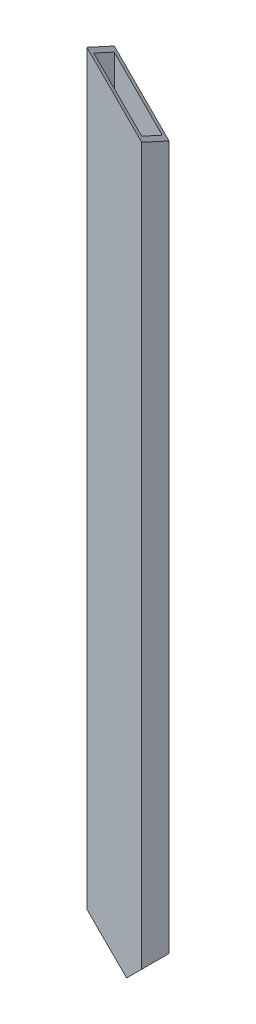
ISO-10303-21;
HEADER;
FILE_DESCRIPTION(('STEP AP214'),'2;1');
FILE_NAME('part.step','',(''),(''),'','','');
FILE_SCHEMA(('AUTOMOTIVE_DESIGN { 1 0 10303 214 1 1 1 1 }'));
ENDSEC;
DATA;
#1=APPLICATION_CONTEXT('core data for automotive mechanical design processes');
#2=APPLICATION_PROTOCOL_DEFINITION('international standard','automotive_design',2000,#1);
#3=PRODUCT_CONTEXT('',#1,'mechanical');
#4=PRODUCT('Part','Part','',(#3));
#5=PRODUCT_RELATED_PRODUCT_CATEGORY('part','',(#4));
#6=PRODUCT_DEFINITION_FORMATION('','',#4);
#7=PRODUCT_DEFINITION_CONTEXT('part definition',#1,'design');
#8=PRODUCT_DEFINITION('design','',#6,#7);
#9=PRODUCT_DEFINITION_SHAPE('','',#8);
#10=(LENGTH_UNIT() NAMED_UNIT(*) SI_UNIT(.MILLI.,.METRE.));
#11=(NAMED_UNIT(*) PLANE_ANGLE_UNIT() SI_UNIT($,.RADIAN.));
#12=(NAMED_UNIT(*) SI_UNIT($,.STERADIAN.) SOLID_ANGLE_UNIT());
#13=UNCERTAINTY_MEASURE_WITH_UNIT(LENGTH_MEASURE(1.E-05),#10,'distance_accuracy_value','');
#14=(GEOMETRIC_REPRESENTATION_CONTEXT(3) GLOBAL_UNCERTAINTY_ASSIGNED_CONTEXT((#13)) GLOBAL_UNIT_ASSIGNED_CONTEXT((#10,
#11,#12)) REPRESENTATION_CONTEXT('',''));
#15=CARTESIAN_POINT('',(0.,0.,0.));
#16=DIRECTION('',(0.,0.,1.));
#17=DIRECTION('',(1.,0.,0.));
#18=AXIS2_PLACEMENT_3D('',#15,#16,#17);
#19=CARTESIAN_POINT('',(25.4,728.3704,12.7));
#20=DIRECTION('',(-1.,0.,0.));
#21=DIRECTION('',(0.,0.,1.));
#22=AXIS2_PLACEMENT_3D('',#19,#20,#21);
#23=PLANE('',#22);
#24=DIRECTION('',(0.,-1.,0.));
#25=VECTOR('',#24,1.);
#26=CARTESIAN_POINT('',(25.4,728.3704,-12.7));
#27=LINE('',#26,#25);
#28=CARTESIAN_POINT('',(25.4,665.898951636196,-12.7));
#29=VERTEX_POINT('',#28);
#30=CARTESIAN_POINT('',(25.4,13.9954000000001,-12.7));
#31=VERTEX_POINT('',#30);
#32=EDGE_CURVE('E57',#29,#31,#27,.T.);
#33=ORIENTED_EDGE('',*,*,#32,.F.);
#34=DIRECTION('',(0.,0.4175349702472,0.908660854566031));
#35=VECTOR('',#34,1.);
#36=CARTESIAN_POINT('',(25.4,686.426640930071,31.9734022901014));
#37=LINE('',#36,#35);
#38=CARTESIAN_POINT('',(25.4,677.570400000001,12.7));
#39=VERTEX_POINT('',#38);
#40=EDGE_CURVE('E126',#29,#39,#37,.T.);
#41=ORIENTED_EDGE('',*,*,#40,.T.);
#42=DIRECTION('',(0.,-1.,0.));
#43=VECTOR('',#42,1.);
#44=CARTESIAN_POINT('',(25.4,728.3704,12.7));
#45=LINE('',#44,#43);
#46=CARTESIAN_POINT('',(25.4,13.9954000000001,12.7));
#47=VERTEX_POINT('',#46);
#48=EDGE_CURVE('E156',#39,#47,#45,.T.);
#49=ORIENTED_EDGE('',*,*,#48,.T.);
#50=DIRECTION('',(0.,0.,1.));
#51=VECTOR('',#50,1.);
#52=CARTESIAN_POINT('',(25.4,13.9954000000001,-12.7));
#53=LINE('',#52,#51);
#54=EDGE_CURVE('E150',#31,#47,#53,.T.);
#55=ORIENTED_EDGE('',*,*,#54,.F.);
#56=EDGE_LOOP('',(#33,#41,#49,#55));
#57=FACE_BOUND('',#56,.T.);
#58=ADVANCED_FACE('F50',(#57),#23,.F.);
#59=CARTESIAN_POINT('',(-25.4,728.3704,-12.7));
#60=DIRECTION('',(0.,0.,1.));
#61=DIRECTION('',(1.,0.,0.));
#62=AXIS2_PLACEMENT_3D('',#59,#60,#61);
#63=PLANE('',#62);
#64=DIRECTION('',(0.,-1.,0.));
#65=VECTOR('',#64,1.);
#66=CARTESIAN_POINT('',(-25.4,728.3704,-12.7));
#67=LINE('',#66,#65);
#68=CARTESIAN_POINT('',(-25.4,716.698951636195,-12.7));
#69=VERTEX_POINT('',#68);
#70=CARTESIAN_POINT('',(-25.4,36.8046,-12.7));
#71=VERTEX_POINT('',#70);
#72=EDGE_CURVE('E146',#69,#71,#67,.T.);
#73=ORIENTED_EDGE('',*,*,#72,.F.);
#74=DIRECTION('',(-0.707106781186556,0.707106781186539,0.));
#75=VECTOR('',#74,1.);
#76=CARTESIAN_POINT('',(483.979529996083,207.319421640124,-12.7));
#77=LINE('',#76,#75);
#78=EDGE_CURVE('E129',#29,#69,#77,.T.);
#79=ORIENTED_EDGE('',*,*,#78,.F.);
#80=ORIENTED_EDGE('',*,*,#32,.T.);
#81=DIRECTION('',(0.707106781186546,0.707106781186549,0.));
#82=VECTOR('',#81,1.);
#83=CARTESIAN_POINT('',(5.70230000000003,-5.7023,-12.7));
#84=LINE('',#83,#82);
#85=CARTESIAN_POINT('',(11.4046,0.,-12.7));
#86=VERTEX_POINT('',#85);
#87=EDGE_CURVE('E191',#86,#31,#84,.T.);
#88=ORIENTED_EDGE('',*,*,#87,.F.);
#89=DIRECTION('',(-0.707106781186548,0.707106781186548,0.));
#90=VECTOR('',#89,1.);
#91=CARTESIAN_POINT('',(5.7023,5.7023,-12.7));
#92=LINE('',#91,#90);
#93=EDGE_CURVE('E181',#86,#71,#92,.T.);
#94=ORIENTED_EDGE('',*,*,#93,.T.);
#95=EDGE_LOOP('',(#73,#79,#80,#88,#94));
#96=FACE_BOUND('',#95,.T.);
#97=ADVANCED_FACE('F142',(#96),#63,.F.);
#98=CARTESIAN_POINT('',(-25.4,728.3704,12.7));
#99=DIRECTION('',(0.,0.,-1.));
#100=DIRECTION('',(-1.,0.,0.));
#101=AXIS2_PLACEMENT_3D('',#98,#99,#100);
#102=PLANE('',#101);
#103=DIRECTION('',(0.707106781186546,0.707106781186549,0.));
#104=VECTOR('',#103,1.);
#105=CARTESIAN_POINT('',(5.70230000000003,-5.7023,12.7));
#106=LINE('',#105,#104);
#107=CARTESIAN_POINT('',(11.4046,0.,12.7));
#108=VERTEX_POINT('',#107);
#109=EDGE_CURVE('E137',#108,#47,#106,.T.);
#110=ORIENTED_EDGE('',*,*,#109,.T.);
#111=ORIENTED_EDGE('',*,*,#48,.F.);
#112=DIRECTION('',(0.707106781186556,-0.707106781186539,0.));
#113=VECTOR('',#112,1.);
#114=CARTESIAN_POINT('',(351.4852,351.485200000009,12.7));
#115=LINE('',#114,#113);
#116=CARTESIAN_POINT('',(-25.4,728.3704,12.7));
#117=VERTEX_POINT('',#116);
#118=EDGE_CURVE('E132',#117,#39,#115,.T.);
#119=ORIENTED_EDGE('',*,*,#118,.F.);
#120=DIRECTION('',(0.,-1.,0.));
#121=VECTOR('',#120,1.);
#122=CARTESIAN_POINT('',(-25.4,728.3704,12.7));
#123=LINE('',#122,#121);
#124=CARTESIAN_POINT('',(-25.4,36.8046,12.7));
#125=VERTEX_POINT('',#124);
#126=EDGE_CURVE('E151',#117,#125,#123,.T.);
#127=ORIENTED_EDGE('',*,*,#126,.T.);
#128=DIRECTION('',(-0.707106781186548,0.707106781186548,0.));
#129=VECTOR('',#128,1.);
#130=CARTESIAN_POINT('',(5.7023,5.7023,12.7));
#131=LINE('',#130,#129);
#132=EDGE_CURVE('E179',#108,#125,#131,.T.);
#133=ORIENTED_EDGE('',*,*,#132,.F.);
#134=EDGE_LOOP('',(#110,#111,#119,#127,#133));
#135=FACE_BOUND('',#134,.T.);
#136=ADVANCED_FACE('F231',(#135),#102,.F.);
#137=CARTESIAN_POINT('',(-22.225,728.3704,9.525));
#138=DIRECTION('',(0.,0.,-1.));
#139=DIRECTION('',(-1.,0.,0.));
#140=AXIS2_PLACEMENT_3D('',#137,#138,#139);
#141=PLANE('',#140);
#142=DIRECTION('',(-0.707106781186556,0.707106781186539,0.));
#143=VECTOR('',#142,1.);
#144=CARTESIAN_POINT('',(-24.5419655227377,726.053434477262,9.525));
#145=LINE('',#144,#143);
#146=CARTESIAN_POINT('',(22.225,679.286468954526,9.525));
#147=VERTEX_POINT('',#146);
#148=CARTESIAN_POINT('',(-22.225,723.736468954525,9.52500000000001));
#149=VERTEX_POINT('',#148);
#150=EDGE_CURVE('E64',#147,#149,#145,.T.);
#151=ORIENTED_EDGE('',*,*,#150,.F.);
#152=DIRECTION('',(0.,-1.,0.));
#153=VECTOR('',#152,1.);
#154=CARTESIAN_POINT('',(22.225,728.3704,9.525));
#155=LINE('',#154,#153);
#156=CARTESIAN_POINT('',(22.225,10.8204,9.525));
#157=VERTEX_POINT('',#156);
#158=EDGE_CURVE('E160',#147,#157,#155,.T.);
#159=ORIENTED_EDGE('',*,*,#158,.T.);
#160=DIRECTION('',(-0.707106781186546,-0.707106781186549,0.));
#161=VECTOR('',#160,1.);
#162=CARTESIAN_POINT('',(358.775,347.370400000002,9.525));
#163=LINE('',#162,#161);
#164=CARTESIAN_POINT('',(11.4046,0.,9.525));
#165=VERTEX_POINT('',#164);
#166=EDGE_CURVE('E182',#157,#165,#163,.T.);
#167=ORIENTED_EDGE('',*,*,#166,.T.);
#168=DIRECTION('',(0.707106781186548,-0.707106781186548,0.));
#169=VECTOR('',#168,1.);
#170=CARTESIAN_POINT('',(-369.5954,381.,9.525));
#171=LINE('',#170,#169);
#172=CARTESIAN_POINT('',(-22.225,33.6296,9.525));
#173=VERTEX_POINT('',#172);
#174=EDGE_CURVE('E167',#173,#165,#171,.T.);
#175=ORIENTED_EDGE('',*,*,#174,.F.);
#176=DIRECTION('',(0.,-1.,0.));
#177=VECTOR('',#176,1.);
#178=CARTESIAN_POINT('',(-22.225,728.3704,9.525));
#179=LINE('',#178,#177);
#180=EDGE_CURVE('E158',#149,#173,#179,.T.);
#181=ORIENTED_EDGE('',*,*,#180,.F.);
#182=EDGE_LOOP('',(#151,#159,#167,#175,#181));
#183=FACE_BOUND('',#182,.T.);
#184=ADVANCED_FACE('F217',(#183),#141,.T.);
#185=CARTESIAN_POINT('',(22.225,728.3704,9.525));
#186=DIRECTION('',(-1.,0.,0.));
#187=DIRECTION('',(0.,0.,1.));
#188=AXIS2_PLACEMENT_3D('',#185,#186,#187);
#189=PLANE('',#188);
#190=DIRECTION('',(0.,0.4175349702472,0.908660854566031));
#191=VECTOR('',#190,1.);
#192=CARTESIAN_POINT('',(22.225,687.84353822881,28.1473297050994));
#193=LINE('',#192,#191);
#194=CARTESIAN_POINT('',(22.225,670.532882681672,-9.525));
#195=VERTEX_POINT('',#194);
#196=EDGE_CURVE('E197',#195,#147,#193,.T.);
#197=ORIENTED_EDGE('',*,*,#196,.F.);
#198=DIRECTION('',(0.,-1.,0.));
#199=VECTOR('',#198,1.);
#200=CARTESIAN_POINT('',(22.225,728.3704,-9.525));
#201=LINE('',#200,#199);
#202=CARTESIAN_POINT('',(22.225,10.8204,-9.525));
#203=VERTEX_POINT('',#202);
#204=EDGE_CURVE('E162',#195,#203,#201,.T.);
#205=ORIENTED_EDGE('',*,*,#204,.T.);
#206=DIRECTION('',(0.,0.,1.));
#207=VECTOR('',#206,1.);
#208=CARTESIAN_POINT('',(22.225,10.8204,9.52500000000013));
#209=LINE('',#208,#207);
#210=EDGE_CURVE('E186',#203,#157,#209,.T.);
#211=ORIENTED_EDGE('',*,*,#210,.T.);
#212=ORIENTED_EDGE('',*,*,#158,.F.);
#213=EDGE_LOOP('',(#197,#205,#211,#212));
#214=FACE_BOUND('',#213,.T.);
#215=ADVANCED_FACE('F222',(#214),#189,.T.);
#216=CARTESIAN_POINT('',(-22.225,728.3704,-9.525));
#217=DIRECTION('',(0.,0.,1.));
#218=DIRECTION('',(1.,0.,0.));
#219=AXIS2_PLACEMENT_3D('',#216,#217,#218);
#220=PLANE('',#219);
#221=DIRECTION('',(0.707106781186556,-0.707106781186539,0.));
#222=VECTOR('',#221,1.);
#223=CARTESIAN_POINT('',(-28.9187586591648,721.676641340835,-9.525));
#224=LINE('',#223,#222);
#225=CARTESIAN_POINT('',(-22.225,714.98288268167,-9.525));
#226=VERTEX_POINT('',#225);
#227=EDGE_CURVE('E199',#226,#195,#224,.T.);
#228=ORIENTED_EDGE('',*,*,#227,.F.);
#229=DIRECTION('',(0.,-1.,0.));
#230=VECTOR('',#229,1.);
#231=CARTESIAN_POINT('',(-22.225,728.3704,-9.525));
#232=LINE('',#231,#230);
#233=CARTESIAN_POINT('',(-22.225,33.6296000000001,-9.525));
#234=VERTEX_POINT('',#233);
#235=EDGE_CURVE('E164',#226,#234,#232,.T.);
#236=ORIENTED_EDGE('',*,*,#235,.T.);
#237=DIRECTION('',(-0.707106781186548,0.707106781186548,0.));
#238=VECTOR('',#237,1.);
#239=CARTESIAN_POINT('',(-369.5954,381.,-9.525));
#240=LINE('',#239,#238);
#241=CARTESIAN_POINT('',(11.4046000000002,0.,-9.525));
#242=VERTEX_POINT('',#241);
#243=EDGE_CURVE('E12',#242,#234,#240,.T.);
#244=ORIENTED_EDGE('',*,*,#243,.F.);
#245=DIRECTION('',(0.707106781186546,0.707106781186549,0.));
#246=VECTOR('',#245,1.);
#247=CARTESIAN_POINT('',(358.775,347.370400000002,-9.525));
#248=LINE('',#247,#246);
#249=EDGE_CURVE('E72',#242,#203,#248,.T.);
#250=ORIENTED_EDGE('',*,*,#249,.T.);
#251=ORIENTED_EDGE('',*,*,#204,.F.);
#252=EDGE_LOOP('',(#228,#236,#244,#250,#251));
#253=FACE_BOUND('',#252,.T.);
#254=ADVANCED_FACE('F208',(#253),#220,.T.);
#255=CARTESIAN_POINT('',(-25.4,728.3704,12.7));
#256=DIRECTION('',(1.,0.,0.));
#257=DIRECTION('',(0.,0.,-1.));
#258=AXIS2_PLACEMENT_3D('',#255,#256,#257);
#259=PLANE('',#258);
#260=ORIENTED_EDGE('',*,*,#126,.F.);
#261=DIRECTION('',(0.,-0.4175349702472,-0.908660854566031));
#262=VECTOR('',#261,1.);
#263=CARTESIAN_POINT('',(-25.4,728.3704,12.6999999999999));
#264=LINE('',#263,#262);
#265=EDGE_CURVE('E138',#117,#69,#264,.T.);
#266=ORIENTED_EDGE('',*,*,#265,.T.);
#267=ORIENTED_EDGE('',*,*,#72,.T.);
#268=DIRECTION('',(0.,0.,1.));
#269=VECTOR('',#268,1.);
#270=CARTESIAN_POINT('',(-25.4,36.8046,-12.7));
#271=LINE('',#270,#269);
#272=EDGE_CURVE('E173',#71,#125,#271,.T.);
#273=ORIENTED_EDGE('',*,*,#272,.T.);
#274=EDGE_LOOP('',(#260,#266,#267,#273));
#275=FACE_BOUND('',#274,.T.);
#276=ADVANCED_FACE('F229',(#275),#259,.F.);
#277=CARTESIAN_POINT('',(-22.225,728.3704,9.525));
#278=DIRECTION('',(1.,0.,0.));
#279=DIRECTION('',(0.,0.,-1.));
#280=AXIS2_PLACEMENT_3D('',#277,#278,#279);
#281=PLANE('',#280);
#282=DIRECTION('',(0.,-0.4175349702472,-0.908660854566031));
#283=VECTOR('',#282,1.);
#284=CARTESIAN_POINT('',(-22.225,724.544327414998,11.2831027012606));
#285=LINE('',#284,#283);
#286=EDGE_CURVE('E147',#149,#226,#285,.T.);
#287=ORIENTED_EDGE('',*,*,#286,.F.);
#288=ORIENTED_EDGE('',*,*,#180,.T.);
#289=DIRECTION('',(0.,0.,1.));
#290=VECTOR('',#289,1.);
#291=CARTESIAN_POINT('',(-22.225,33.6296,9.525));
#292=LINE('',#291,#290);
#293=EDGE_CURVE('E170',#234,#173,#292,.T.);
#294=ORIENTED_EDGE('',*,*,#293,.F.);
#295=ORIENTED_EDGE('',*,*,#235,.F.);
#296=EDGE_LOOP('',(#287,#288,#294,#295));
#297=FACE_BOUND('',#296,.T.);
#298=ADVANCED_FACE('F211',(#297),#281,.T.);
#299=CARTESIAN_POINT('',(5.7023,5.7023,-12.7));
#300=DIRECTION('',(0.707106781186548,0.707106781186548,0.));
#301=DIRECTION('',(-0.707106781186548,0.707106781186548,0.));
#302=AXIS2_PLACEMENT_3D('',#299,#300,#301);
#303=PLANE('',#302);
#304=ORIENTED_EDGE('',*,*,#174,.T.);
#305=DIRECTION('',(0.,0.,1.));
#306=VECTOR('',#305,1.);
#307=CARTESIAN_POINT('',(11.4046,0.,-12.7));
#308=LINE('',#307,#306);
#309=EDGE_CURVE('E176',#165,#108,#308,.T.);
#310=ORIENTED_EDGE('',*,*,#309,.T.);
#311=ORIENTED_EDGE('',*,*,#132,.T.);
#312=ORIENTED_EDGE('',*,*,#272,.F.);
#313=ORIENTED_EDGE('',*,*,#93,.F.);
#314=EDGE_CURVE('E174',#86,#242,#308,.T.);
#315=ORIENTED_EDGE('',*,*,#314,.T.);
#316=ORIENTED_EDGE('',*,*,#243,.T.);
#317=ORIENTED_EDGE('',*,*,#293,.T.);
#318=EDGE_LOOP('',(#304,#310,#311,#312,#313,#315,#316,#317));
#319=FACE_BOUND('',#318,.T.);
#320=ADVANCED_FACE('F214',(#319),#303,.F.);
#321=CARTESIAN_POINT('',(5.70230000000003,-5.7023,-12.7));
#322=DIRECTION('',(0.707106781186549,-0.707106781186546,0.));
#323=DIRECTION('',(0.707106781186546,0.707106781186549,0.));
#324=AXIS2_PLACEMENT_3D('',#321,#322,#323);
#325=PLANE('',#324);
#326=ORIENTED_EDGE('',*,*,#210,.F.);
#327=ORIENTED_EDGE('',*,*,#249,.F.);
#328=ORIENTED_EDGE('',*,*,#314,.F.);
#329=ORIENTED_EDGE('',*,*,#87,.T.);
#330=ORIENTED_EDGE('',*,*,#54,.T.);
#331=ORIENTED_EDGE('',*,*,#109,.F.);
#332=ORIENTED_EDGE('',*,*,#309,.F.);
#333=ORIENTED_EDGE('',*,*,#166,.F.);
#334=EDGE_LOOP('',(#326,#327,#328,#329,#330,#331,#332,#333));
#335=FACE_BOUND('',#334,.T.);
#336=ADVANCED_FACE('F220',(#335),#325,.T.);
#337=CARTESIAN_POINT('',(489.815254177986,213.155145822027,12.7));
#338=DIRECTION('',(-0.67249851196395,-0.672498511963967,0.309016994374942));
#339=DIRECTION('',(0.707106781186556,-0.707106781186539,0.));
#340=AXIS2_PLACEMENT_3D('',#337,#338,#339);
#341=PLANE('',#340);
#342=ORIENTED_EDGE('',*,*,#150,.T.);
#343=ORIENTED_EDGE('',*,*,#286,.T.);
#344=ORIENTED_EDGE('',*,*,#227,.T.);
#345=ORIENTED_EDGE('',*,*,#196,.T.);
#346=EDGE_LOOP('',(#342,#343,#344,#345));
#347=FACE_BOUND('',#346,.T.);
#348=ORIENTED_EDGE('',*,*,#78,.T.);
#349=ORIENTED_EDGE('',*,*,#265,.F.);
#350=ORIENTED_EDGE('',*,*,#118,.T.);
#351=ORIENTED_EDGE('',*,*,#40,.F.);
#352=EDGE_LOOP('',(#348,#349,#350,#351));
#353=FACE_BOUND('',#352,.T.);
#354=ADVANCED_FACE('F128',(#347,#353),#341,.F.);
#355=CLOSED_SHELL('',(#58,#97,#136,#184,#215,#254,#276,#298,#320,#336,#354));
#356=MANIFOLD_SOLID_BREP('B2',#355);
#357=ADVANCED_BREP_SHAPE_REPRESENTATION('',(#18,#356),#14);
#358=SHAPE_DEFINITION_REPRESENTATION(#9,#357);
ENDSEC;
END-ISO-10303-21;
